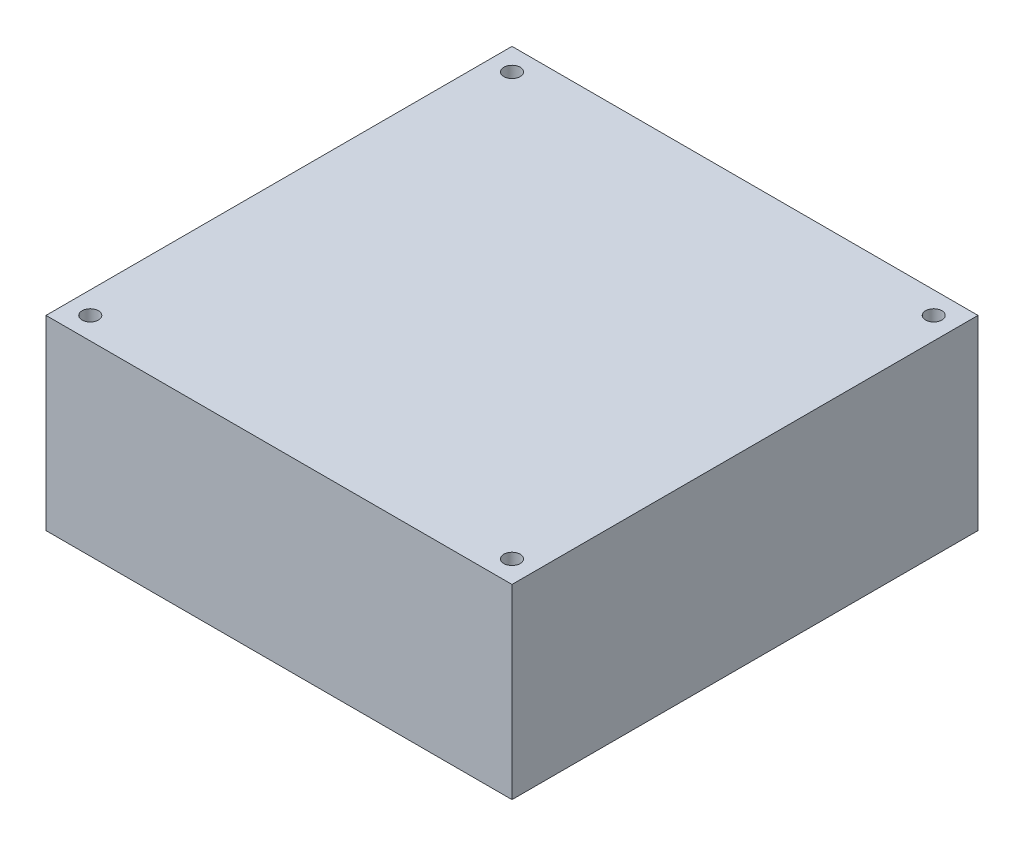
ISO-10303-21;
HEADER;
FILE_DESCRIPTION(('STEP AP214'),'2;1');
FILE_NAME('part.step','',(''),(''),'','','');
FILE_SCHEMA(('AUTOMOTIVE_DESIGN { 1 0 10303 214 1 1 1 1 }'));
ENDSEC;
DATA;
#1=APPLICATION_CONTEXT('core data for automotive mechanical design processes');
#2=APPLICATION_PROTOCOL_DEFINITION('international standard','automotive_design',2000,#1);
#3=PRODUCT_CONTEXT('',#1,'mechanical');
#4=PRODUCT('Part','Part','',(#3));
#5=PRODUCT_RELATED_PRODUCT_CATEGORY('part','',(#4));
#6=PRODUCT_DEFINITION_FORMATION('','',#4);
#7=PRODUCT_DEFINITION_CONTEXT('part definition',#1,'design');
#8=PRODUCT_DEFINITION('design','',#6,#7);
#9=PRODUCT_DEFINITION_SHAPE('','',#8);
#10=(LENGTH_UNIT() NAMED_UNIT(*) SI_UNIT(.MILLI.,.METRE.));
#11=(NAMED_UNIT(*) PLANE_ANGLE_UNIT() SI_UNIT($,.RADIAN.));
#12=(NAMED_UNIT(*) SI_UNIT($,.STERADIAN.) SOLID_ANGLE_UNIT());
#13=UNCERTAINTY_MEASURE_WITH_UNIT(LENGTH_MEASURE(1.E-05),#10,'distance_accuracy_value','');
#14=(GEOMETRIC_REPRESENTATION_CONTEXT(3) GLOBAL_UNCERTAINTY_ASSIGNED_CONTEXT((#13)) GLOBAL_UNIT_ASSIGNED_CONTEXT((#10,
#11,#12)) REPRESENTATION_CONTEXT('',''));
#15=CARTESIAN_POINT('',(0.,0.,0.));
#16=DIRECTION('',(0.,0.,1.));
#17=DIRECTION('',(1.,0.,0.));
#18=AXIS2_PLACEMENT_3D('',#15,#16,#17);
#19=CARTESIAN_POINT('',(100.,0.,-100.));
#20=DIRECTION('',(0.,0.,-1.));
#21=DIRECTION('',(-1.,0.,0.));
#22=AXIS2_PLACEMENT_3D('',#19,#20,#21);
#23=PLANE('',#22);
#24=DIRECTION('',(-1.,0.,0.));
#25=VECTOR('',#24,1.);
#26=CARTESIAN_POINT('',(100.,40.,-100.));
#27=LINE('',#26,#25);
#28=CARTESIAN_POINT('',(100.,40.,-100.));
#29=VERTEX_POINT('',#28);
#30=CARTESIAN_POINT('',(0.,40.,-100.));
#31=VERTEX_POINT('',#30);
#32=EDGE_CURVE('E112',#29,#31,#27,.T.);
#33=ORIENTED_EDGE('',*,*,#32,.F.);
#34=DIRECTION('',(0.,1.,0.));
#35=VECTOR('',#34,1.);
#36=CARTESIAN_POINT('',(100.,0.,-100.));
#37=LINE('',#36,#35);
#38=CARTESIAN_POINT('',(100.,0.,-100.));
#39=VERTEX_POINT('',#38);
#40=EDGE_CURVE('E13',#39,#29,#37,.T.);
#41=ORIENTED_EDGE('',*,*,#40,.F.);
#42=DIRECTION('',(-1.,0.,0.));
#43=VECTOR('',#42,1.);
#44=CARTESIAN_POINT('',(100.,0.,-100.));
#45=LINE('',#44,#43);
#46=CARTESIAN_POINT('',(0.,0.,-100.));
#47=VERTEX_POINT('',#46);
#48=EDGE_CURVE('E105',#39,#47,#45,.T.);
#49=ORIENTED_EDGE('',*,*,#48,.T.);
#50=DIRECTION('',(0.,1.,0.));
#51=VECTOR('',#50,1.);
#52=CARTESIAN_POINT('',(0.,0.,-100.));
#53=LINE('',#52,#51);
#54=EDGE_CURVE('E50',#47,#31,#53,.T.);
#55=ORIENTED_EDGE('',*,*,#54,.T.);
#56=EDGE_LOOP('',(#33,#41,#49,#55));
#57=FACE_BOUND('',#56,.T.);
#58=ADVANCED_FACE('F47',(#57),#23,.T.);
#59=CARTESIAN_POINT('',(100.,0.,0.));
#60=DIRECTION('',(1.,0.,0.));
#61=DIRECTION('',(0.,0.,-1.));
#62=AXIS2_PLACEMENT_3D('',#59,#60,#61);
#63=PLANE('',#62);
#64=DIRECTION('',(0.,0.,-1.));
#65=VECTOR('',#64,1.);
#66=CARTESIAN_POINT('',(100.,40.,0.));
#67=LINE('',#66,#65);
#68=CARTESIAN_POINT('',(100.,40.,0.));
#69=VERTEX_POINT('',#68);
#70=EDGE_CURVE('E107',#69,#29,#67,.T.);
#71=ORIENTED_EDGE('',*,*,#70,.F.);
#72=DIRECTION('',(0.,1.,0.));
#73=VECTOR('',#72,1.);
#74=CARTESIAN_POINT('',(100.,0.,0.));
#75=LINE('',#74,#73);
#76=CARTESIAN_POINT('',(100.,0.,0.));
#77=VERTEX_POINT('',#76);
#78=EDGE_CURVE('E56',#77,#69,#75,.T.);
#79=ORIENTED_EDGE('',*,*,#78,.F.);
#80=DIRECTION('',(0.,0.,-1.));
#81=VECTOR('',#80,1.);
#82=CARTESIAN_POINT('',(100.,0.,0.));
#83=LINE('',#82,#81);
#84=EDGE_CURVE('E102',#77,#39,#83,.T.);
#85=ORIENTED_EDGE('',*,*,#84,.T.);
#86=ORIENTED_EDGE('',*,*,#40,.T.);
#87=EDGE_LOOP('',(#71,#79,#85,#86));
#88=FACE_BOUND('',#87,.T.);
#89=ADVANCED_FACE('F123',(#88),#63,.T.);
#90=CARTESIAN_POINT('',(0.,0.,0.));
#91=DIRECTION('',(0.,0.,1.));
#92=DIRECTION('',(1.,0.,0.));
#93=AXIS2_PLACEMENT_3D('',#90,#91,#92);
#94=PLANE('',#93);
#95=DIRECTION('',(1.,0.,0.));
#96=VECTOR('',#95,1.);
#97=CARTESIAN_POINT('',(0.,40.,0.));
#98=LINE('',#97,#96);
#99=CARTESIAN_POINT('',(0.,40.,0.));
#100=VERTEX_POINT('',#99);
#101=EDGE_CURVE('E97',#100,#69,#98,.T.);
#102=ORIENTED_EDGE('',*,*,#101,.F.);
#103=DIRECTION('',(0.,1.,0.));
#104=VECTOR('',#103,1.);
#105=CARTESIAN_POINT('',(0.,0.,0.));
#106=LINE('',#105,#104);
#107=CARTESIAN_POINT('',(0.,0.,0.));
#108=VERTEX_POINT('',#107);
#109=EDGE_CURVE('E92',#108,#100,#106,.T.);
#110=ORIENTED_EDGE('',*,*,#109,.F.);
#111=DIRECTION('',(1.,0.,0.));
#112=VECTOR('',#111,1.);
#113=CARTESIAN_POINT('',(0.,0.,0.));
#114=LINE('',#113,#112);
#115=EDGE_CURVE('E95',#108,#77,#114,.T.);
#116=ORIENTED_EDGE('',*,*,#115,.T.);
#117=ORIENTED_EDGE('',*,*,#78,.T.);
#118=EDGE_LOOP('',(#102,#110,#116,#117));
#119=FACE_BOUND('',#118,.T.);
#120=ADVANCED_FACE('F94',(#119),#94,.T.);
#121=CARTESIAN_POINT('',(0.,0.,-100.));
#122=DIRECTION('',(-1.,0.,0.));
#123=DIRECTION('',(0.,0.,1.));
#124=AXIS2_PLACEMENT_3D('',#121,#122,#123);
#125=PLANE('',#124);
#126=DIRECTION('',(0.,0.,1.));
#127=VECTOR('',#126,1.);
#128=CARTESIAN_POINT('',(0.,40.,-100.));
#129=LINE('',#128,#127);
#130=EDGE_CURVE('E115',#31,#100,#129,.T.);
#131=ORIENTED_EDGE('',*,*,#130,.F.);
#132=ORIENTED_EDGE('',*,*,#54,.F.);
#133=DIRECTION('',(0.,0.,1.));
#134=VECTOR('',#133,1.);
#135=CARTESIAN_POINT('',(0.,0.,-100.));
#136=LINE('',#135,#134);
#137=EDGE_CURVE('E101',#47,#108,#136,.T.);
#138=ORIENTED_EDGE('',*,*,#137,.T.);
#139=ORIENTED_EDGE('',*,*,#109,.T.);
#140=EDGE_LOOP('',(#131,#132,#138,#139));
#141=FACE_BOUND('',#140,.T.);
#142=ADVANCED_FACE('F104',(#141),#125,.T.);
#143=CARTESIAN_POINT('',(0.,0.,0.));
#144=DIRECTION('',(0.,1.,0.));
#145=DIRECTION('',(0.,0.,1.));
#146=AXIS2_PLACEMENT_3D('',#143,#144,#145);
#147=PLANE('',#146);
#148=CARTESIAN_POINT('',(4.75,0.,-4.75));
#149=DIRECTION('',(0.,1.,0.));
#150=DIRECTION('',(0.,0.,-1.));
#151=AXIS2_PLACEMENT_3D('',#148,#149,#150);
#152=CIRCLE('',#151,1.75);
#153=CARTESIAN_POINT('',(4.75,0.,-6.5));
#154=VERTEX_POINT('',#153);
#155=EDGE_CURVE('E164',#154,#154,#152,.T.);
#156=ORIENTED_EDGE('',*,*,#155,.T.);
#157=EDGE_LOOP('',(#156));
#158=FACE_BOUND('',#157,.T.);
#159=CARTESIAN_POINT('',(95.25,0.,-4.75));
#160=DIRECTION('',(0.,1.,0.));
#161=DIRECTION('',(0.,0.,-1.));
#162=AXIS2_PLACEMENT_3D('',#159,#160,#161);
#163=CIRCLE('',#162,1.75);
#164=CARTESIAN_POINT('',(95.25,0.,-6.5));
#165=VERTEX_POINT('',#164);
#166=EDGE_CURVE('E172',#165,#165,#163,.T.);
#167=ORIENTED_EDGE('',*,*,#166,.T.);
#168=EDGE_LOOP('',(#167));
#169=FACE_BOUND('',#168,.T.);
#170=CARTESIAN_POINT('',(95.25,0.,-95.25));
#171=DIRECTION('',(0.,1.,0.));
#172=DIRECTION('',(0.,0.,-1.));
#173=AXIS2_PLACEMENT_3D('',#170,#171,#172);
#174=CIRCLE('',#173,1.75);
#175=CARTESIAN_POINT('',(95.25,0.,-97.));
#176=VERTEX_POINT('',#175);
#177=EDGE_CURVE('E178',#176,#176,#174,.T.);
#178=ORIENTED_EDGE('',*,*,#177,.T.);
#179=EDGE_LOOP('',(#178));
#180=FACE_BOUND('',#179,.T.);
#181=CARTESIAN_POINT('',(4.75,0.,-95.25));
#182=DIRECTION('',(0.,1.,0.));
#183=DIRECTION('',(0.,0.,-1.));
#184=AXIS2_PLACEMENT_3D('',#181,#182,#183);
#185=CIRCLE('',#184,1.75);
#186=CARTESIAN_POINT('',(4.75,0.,-97.));
#187=VERTEX_POINT('',#186);
#188=EDGE_CURVE('E116',#187,#187,#185,.T.);
#189=ORIENTED_EDGE('',*,*,#188,.T.);
#190=EDGE_LOOP('',(#189));
#191=FACE_BOUND('',#190,.T.);
#192=ORIENTED_EDGE('',*,*,#48,.F.);
#193=ORIENTED_EDGE('',*,*,#84,.F.);
#194=ORIENTED_EDGE('',*,*,#115,.F.);
#195=ORIENTED_EDGE('',*,*,#137,.F.);
#196=EDGE_LOOP('',(#192,#193,#194,#195));
#197=FACE_BOUND('',#196,.T.);
#198=ADVANCED_FACE('F100',(#158,#169,#180,#191,#197),#147,.F.);
#199=CARTESIAN_POINT('',(0.,40.,0.));
#200=DIRECTION('',(0.,1.,0.));
#201=DIRECTION('',(0.,0.,1.));
#202=AXIS2_PLACEMENT_3D('',#199,#200,#201);
#203=PLANE('',#202);
#204=CARTESIAN_POINT('',(4.75,40.,-4.75));
#205=DIRECTION('',(0.,1.,0.));
#206=DIRECTION('',(0.,0.,-1.));
#207=AXIS2_PLACEMENT_3D('',#204,#205,#206);
#208=CIRCLE('',#207,1.75);
#209=CARTESIAN_POINT('',(4.75,40.,-6.5));
#210=VERTEX_POINT('',#209);
#211=EDGE_CURVE('E167',#210,#210,#208,.T.);
#212=ORIENTED_EDGE('',*,*,#211,.F.);
#213=EDGE_LOOP('',(#212));
#214=FACE_BOUND('',#213,.T.);
#215=CARTESIAN_POINT('',(95.25,40.,-4.75));
#216=DIRECTION('',(0.,1.,0.));
#217=DIRECTION('',(0.,0.,-1.));
#218=AXIS2_PLACEMENT_3D('',#215,#216,#217);
#219=CIRCLE('',#218,1.75);
#220=CARTESIAN_POINT('',(95.25,40.,-6.5));
#221=VERTEX_POINT('',#220);
#222=EDGE_CURVE('E169',#221,#221,#219,.T.);
#223=ORIENTED_EDGE('',*,*,#222,.F.);
#224=EDGE_LOOP('',(#223));
#225=FACE_BOUND('',#224,.T.);
#226=CARTESIAN_POINT('',(95.25,40.,-95.25));
#227=DIRECTION('',(0.,1.,0.));
#228=DIRECTION('',(0.,0.,-1.));
#229=AXIS2_PLACEMENT_3D('',#226,#227,#228);
#230=CIRCLE('',#229,1.75);
#231=CARTESIAN_POINT('',(95.25,40.,-97.));
#232=VERTEX_POINT('',#231);
#233=EDGE_CURVE('E175',#232,#232,#230,.T.);
#234=ORIENTED_EDGE('',*,*,#233,.F.);
#235=EDGE_LOOP('',(#234));
#236=FACE_BOUND('',#235,.T.);
#237=CARTESIAN_POINT('',(4.75,40.,-95.25));
#238=DIRECTION('',(0.,1.,0.));
#239=DIRECTION('',(0.,0.,-1.));
#240=AXIS2_PLACEMENT_3D('',#237,#238,#239);
#241=CIRCLE('',#240,1.75);
#242=CARTESIAN_POINT('',(4.75,40.,-97.));
#243=VERTEX_POINT('',#242);
#244=EDGE_CURVE('E181',#243,#243,#241,.T.);
#245=ORIENTED_EDGE('',*,*,#244,.F.);
#246=EDGE_LOOP('',(#245));
#247=FACE_BOUND('',#246,.T.);
#248=ORIENTED_EDGE('',*,*,#32,.T.);
#249=ORIENTED_EDGE('',*,*,#130,.T.);
#250=ORIENTED_EDGE('',*,*,#101,.T.);
#251=ORIENTED_EDGE('',*,*,#70,.T.);
#252=EDGE_LOOP('',(#248,#249,#250,#251));
#253=FACE_BOUND('',#252,.T.);
#254=ADVANCED_FACE('F122',(#214,#225,#236,#247,#253),#203,.T.);
#255=CARTESIAN_POINT('',(4.75,0.,-95.25));
#256=DIRECTION('',(0.,1.,0.));
#257=DIRECTION('',(0.,0.,1.));
#258=AXIS2_PLACEMENT_3D('',#255,#256,#257);
#259=CYLINDRICAL_SURFACE('',#258,1.75);
#260=ORIENTED_EDGE('',*,*,#188,.F.);
#261=EDGE_LOOP('',(#260));
#262=FACE_BOUND('',#261,.T.);
#263=ORIENTED_EDGE('',*,*,#244,.T.);
#264=EDGE_LOOP('',(#263));
#265=FACE_BOUND('',#264,.T.);
#266=ADVANCED_FACE('F141',(#262,#265),#259,.F.);
#267=CARTESIAN_POINT('',(95.25,0.,-95.25));
#268=DIRECTION('',(0.,1.,0.));
#269=DIRECTION('',(0.,0.,1.));
#270=AXIS2_PLACEMENT_3D('',#267,#268,#269);
#271=CYLINDRICAL_SURFACE('',#270,1.75);
#272=ORIENTED_EDGE('',*,*,#177,.F.);
#273=EDGE_LOOP('',(#272));
#274=FACE_BOUND('',#273,.T.);
#275=ORIENTED_EDGE('',*,*,#233,.T.);
#276=EDGE_LOOP('',(#275));
#277=FACE_BOUND('',#276,.T.);
#278=ADVANCED_FACE('F148',(#274,#277),#271,.F.);
#279=CARTESIAN_POINT('',(95.25,0.,-4.75));
#280=DIRECTION('',(0.,1.,0.));
#281=DIRECTION('',(0.,0.,1.));
#282=AXIS2_PLACEMENT_3D('',#279,#280,#281);
#283=CYLINDRICAL_SURFACE('',#282,1.75);
#284=ORIENTED_EDGE('',*,*,#166,.F.);
#285=EDGE_LOOP('',(#284));
#286=FACE_BOUND('',#285,.T.);
#287=ORIENTED_EDGE('',*,*,#222,.T.);
#288=EDGE_LOOP('',(#287));
#289=FACE_BOUND('',#288,.T.);
#290=ADVANCED_FACE('F152',(#286,#289),#283,.F.);
#291=CARTESIAN_POINT('',(4.75,0.,-4.75));
#292=DIRECTION('',(0.,1.,0.));
#293=DIRECTION('',(0.,0.,1.));
#294=AXIS2_PLACEMENT_3D('',#291,#292,#293);
#295=CYLINDRICAL_SURFACE('',#294,1.75);
#296=ORIENTED_EDGE('',*,*,#155,.F.);
#297=EDGE_LOOP('',(#296));
#298=FACE_BOUND('',#297,.T.);
#299=ORIENTED_EDGE('',*,*,#211,.T.);
#300=EDGE_LOOP('',(#299));
#301=FACE_BOUND('',#300,.T.);
#302=ADVANCED_FACE('F156',(#298,#301),#295,.F.);
#303=CLOSED_SHELL('',(#58,#89,#120,#142,#198,#254,#266,#278,#290,#302));
#304=MANIFOLD_SOLID_BREP('B2',#303);
#305=ADVANCED_BREP_SHAPE_REPRESENTATION('',(#18,#304),#14);
#306=SHAPE_DEFINITION_REPRESENTATION(#9,#305);
ENDSEC;
END-ISO-10303-21;
